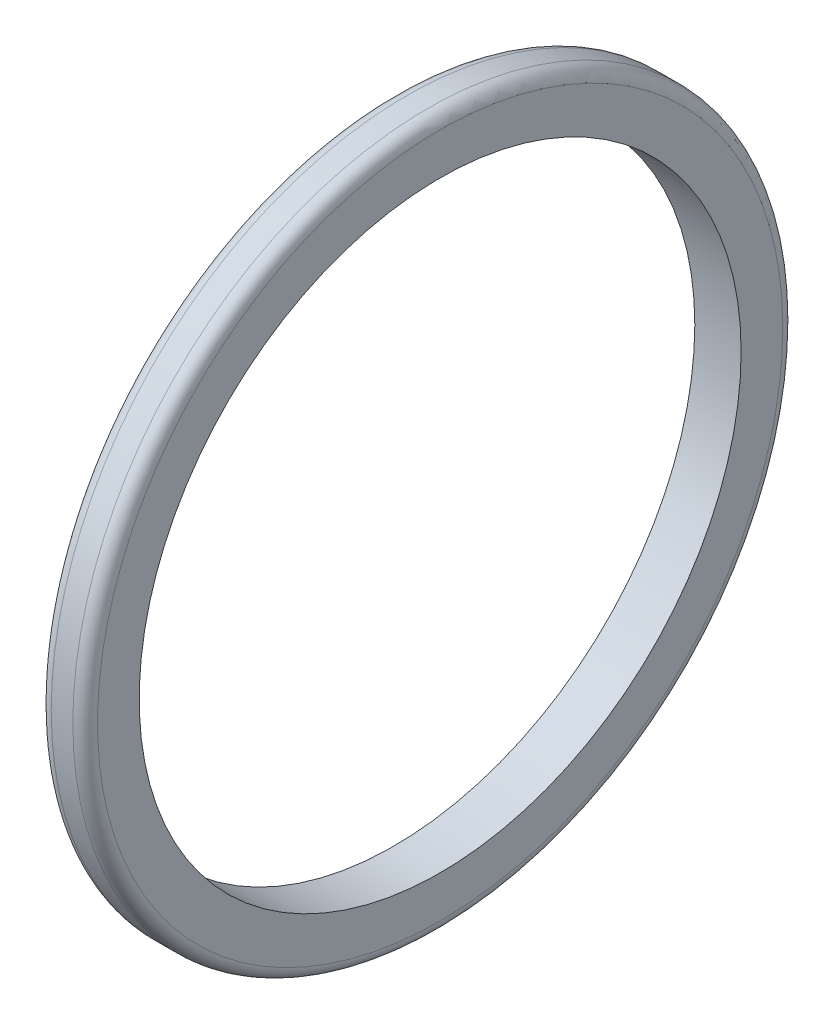
ISO-10303-21;
HEADER;
FILE_DESCRIPTION(('STEP AP214'),'2;1');
FILE_NAME('part.step','',(''),(''),'','','');
FILE_SCHEMA(('AUTOMOTIVE_DESIGN { 1 0 10303 214 1 1 1 1 }'));
ENDSEC;
DATA;
#1=APPLICATION_CONTEXT('core data for automotive mechanical design processes');
#2=APPLICATION_PROTOCOL_DEFINITION('international standard','automotive_design',2000,#1);
#3=PRODUCT_CONTEXT('',#1,'mechanical');
#4=PRODUCT('Part','Part','',(#3));
#5=PRODUCT_RELATED_PRODUCT_CATEGORY('part','',(#4));
#6=PRODUCT_DEFINITION_FORMATION('','',#4);
#7=PRODUCT_DEFINITION_CONTEXT('part definition',#1,'design');
#8=PRODUCT_DEFINITION('design','',#6,#7);
#9=PRODUCT_DEFINITION_SHAPE('','',#8);
#10=(LENGTH_UNIT() NAMED_UNIT(*) SI_UNIT(.MILLI.,.METRE.));
#11=(NAMED_UNIT(*) PLANE_ANGLE_UNIT() SI_UNIT($,.RADIAN.));
#12=(NAMED_UNIT(*) SI_UNIT($,.STERADIAN.) SOLID_ANGLE_UNIT());
#13=UNCERTAINTY_MEASURE_WITH_UNIT(LENGTH_MEASURE(1.E-05),#10,'distance_accuracy_value','');
#14=(GEOMETRIC_REPRESENTATION_CONTEXT(3) GLOBAL_UNCERTAINTY_ASSIGNED_CONTEXT((#13)) GLOBAL_UNIT_ASSIGNED_CONTEXT((#10,
#11,#12)) REPRESENTATION_CONTEXT('',''));
#15=CARTESIAN_POINT('',(0.,0.,0.));
#16=DIRECTION('',(0.,0.,1.));
#17=DIRECTION('',(1.,0.,0.));
#18=AXIS2_PLACEMENT_3D('',#15,#16,#17);
#19=CARTESIAN_POINT('',(30.,0.,0.));
#20=DIRECTION('',(-1.,0.,0.));
#21=DIRECTION('',(0.,0.,1.));
#22=AXIS2_PLACEMENT_3D('',#19,#20,#21);
#23=CYLINDRICAL_SURFACE('',#22,230.);
#24=CARTESIAN_POINT('',(8.,0.,0.));
#25=DIRECTION('',(1.,0.,0.));
#26=DIRECTION('',(0.,0.,-1.));
#27=AXIS2_PLACEMENT_3D('',#24,#25,#26);
#28=CIRCLE('',#27,230.);
#29=CARTESIAN_POINT('',(8.,0.,-230.));
#30=VERTEX_POINT('',#29);
#31=EDGE_CURVE('E42',#30,#30,#28,.T.);
#32=ORIENTED_EDGE('',*,*,#31,.T.);
#33=EDGE_LOOP('',(#32));
#34=FACE_BOUND('',#33,.T.);
#35=CARTESIAN_POINT('',(22.,0.,0.));
#36=DIRECTION('',(1.,0.,0.));
#37=DIRECTION('',(0.,0.,-1.));
#38=AXIS2_PLACEMENT_3D('',#35,#36,#37);
#39=CIRCLE('',#38,230.);
#40=CARTESIAN_POINT('',(22.,0.,-230.));
#41=VERTEX_POINT('',#40);
#42=EDGE_CURVE('E46',#41,#41,#39,.F.);
#43=ORIENTED_EDGE('',*,*,#42,.T.);
#44=EDGE_LOOP('',(#43));
#45=FACE_BOUND('',#44,.T.);
#46=ADVANCED_FACE('F31',(#34,#45),#23,.T.);
#47=CARTESIAN_POINT('',(30.,0.,0.));
#48=DIRECTION('',(1.,0.,0.));
#49=DIRECTION('',(0.,0.,-1.));
#50=AXIS2_PLACEMENT_3D('',#47,#48,#49);
#51=PLANE('',#50);
#52=CARTESIAN_POINT('',(30.,0.,0.));
#53=DIRECTION('',(1.,0.,0.));
#54=DIRECTION('',(0.,0.,-1.));
#55=AXIS2_PLACEMENT_3D('',#52,#53,#54);
#56=CIRCLE('',#55,195.);
#57=CARTESIAN_POINT('',(30.,0.,-195.));
#58=VERTEX_POINT('',#57);
#59=EDGE_CURVE('E52',#58,#58,#56,.T.);
#60=ORIENTED_EDGE('',*,*,#59,.F.);
#61=EDGE_LOOP('',(#60));
#62=FACE_BOUND('',#61,.T.);
#63=CARTESIAN_POINT('',(30.,0.,0.));
#64=DIRECTION('',(1.,0.,0.));
#65=DIRECTION('',(0.,0.,-1.));
#66=AXIS2_PLACEMENT_3D('',#63,#64,#65);
#67=CIRCLE('',#66,222.);
#68=CARTESIAN_POINT('',(30.,0.,-222.));
#69=VERTEX_POINT('',#68);
#70=EDGE_CURVE('E10',#69,#69,#67,.T.);
#71=ORIENTED_EDGE('',*,*,#70,.T.);
#72=EDGE_LOOP('',(#71));
#73=FACE_BOUND('',#72,.T.);
#74=ADVANCED_FACE('F66',(#62,#73),#51,.T.);
#75=CARTESIAN_POINT('',(0.,0.,0.));
#76=DIRECTION('',(1.,0.,0.));
#77=DIRECTION('',(0.,0.,-1.));
#78=AXIS2_PLACEMENT_3D('',#75,#76,#77);
#79=PLANE('',#78);
#80=CARTESIAN_POINT('',(0.,0.,0.));
#81=DIRECTION('',(1.,0.,0.));
#82=DIRECTION('',(0.,0.,-1.));
#83=AXIS2_PLACEMENT_3D('',#80,#81,#82);
#84=CIRCLE('',#83,195.);
#85=CARTESIAN_POINT('',(0.,0.,-195.));
#86=VERTEX_POINT('',#85);
#87=EDGE_CURVE('E51',#86,#86,#84,.T.);
#88=ORIENTED_EDGE('',*,*,#87,.T.);
#89=EDGE_LOOP('',(#88));
#90=FACE_BOUND('',#89,.T.);
#91=CARTESIAN_POINT('',(0.,0.,0.));
#92=DIRECTION('',(1.,0.,0.));
#93=DIRECTION('',(0.,0.,-1.));
#94=AXIS2_PLACEMENT_3D('',#91,#92,#93);
#95=CIRCLE('',#94,222.);
#96=CARTESIAN_POINT('',(0.,0.,-222.));
#97=VERTEX_POINT('',#96);
#98=EDGE_CURVE('E38',#97,#97,#95,.F.);
#99=ORIENTED_EDGE('',*,*,#98,.T.);
#100=EDGE_LOOP('',(#99));
#101=FACE_BOUND('',#100,.T.);
#102=ADVANCED_FACE('F58',(#90,#101),#79,.F.);
#103=CARTESIAN_POINT('',(8.,0.,0.));
#104=DIRECTION('',(1.,0.,0.));
#105=DIRECTION('',(0.,0.,-1.));
#106=AXIS2_PLACEMENT_3D('',#103,#104,#105);
#107=TOROIDAL_SURFACE('',#106,222.,8.);
#108=ORIENTED_EDGE('',*,*,#98,.F.);
#109=EDGE_LOOP('',(#108));
#110=FACE_BOUND('',#109,.T.);
#111=ORIENTED_EDGE('',*,*,#31,.F.);
#112=EDGE_LOOP('',(#111));
#113=FACE_BOUND('',#112,.T.);
#114=ADVANCED_FACE('F73',(#110,#113),#107,.T.);
#115=CARTESIAN_POINT('',(22.,0.,0.));
#116=DIRECTION('',(1.,0.,0.));
#117=DIRECTION('',(0.,0.,-1.));
#118=AXIS2_PLACEMENT_3D('',#115,#116,#117);
#119=TOROIDAL_SURFACE('',#118,222.,8.);
#120=ORIENTED_EDGE('',*,*,#42,.F.);
#121=EDGE_LOOP('',(#120));
#122=FACE_BOUND('',#121,.T.);
#123=ORIENTED_EDGE('',*,*,#70,.F.);
#124=EDGE_LOOP('',(#123));
#125=FACE_BOUND('',#124,.T.);
#126=ADVANCED_FACE('F33',(#122,#125),#119,.T.);
#127=CARTESIAN_POINT('',(0.,0.,0.));
#128=DIRECTION('',(1.,0.,0.));
#129=DIRECTION('',(0.,0.,-1.));
#130=AXIS2_PLACEMENT_3D('',#127,#128,#129);
#131=CYLINDRICAL_SURFACE('',#130,195.);
#132=ORIENTED_EDGE('',*,*,#87,.F.);
#133=EDGE_LOOP('',(#132));
#134=FACE_BOUND('',#133,.T.);
#135=ORIENTED_EDGE('',*,*,#59,.T.);
#136=EDGE_LOOP('',(#135));
#137=FACE_BOUND('',#136,.T.);
#138=ADVANCED_FACE('F60',(#134,#137),#131,.F.);
#139=CLOSED_SHELL('',(#46,#74,#102,#114,#126,#138));
#140=MANIFOLD_SOLID_BREP('B2',#139);
#141=ADVANCED_BREP_SHAPE_REPRESENTATION('',(#18,#140),#14);
#142=SHAPE_DEFINITION_REPRESENTATION(#9,#141);
ENDSEC;
END-ISO-10303-21;
